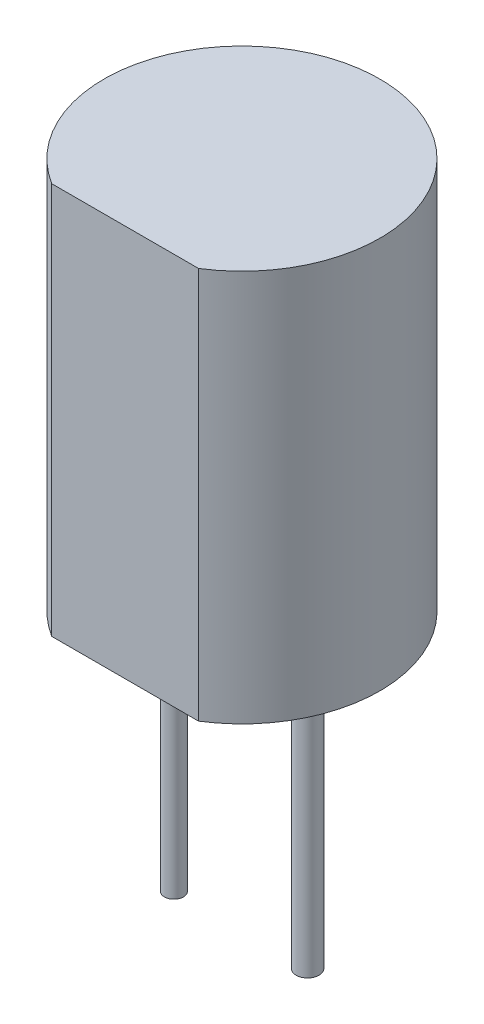
ISO-10303-21;
HEADER;
FILE_DESCRIPTION(('STEP AP214'),'2;1');
FILE_NAME('part.step','',(''),(''),'','','');
FILE_SCHEMA(('AUTOMOTIVE_DESIGN { 1 0 10303 214 1 1 1 1 }'));
ENDSEC;
DATA;
#1=APPLICATION_CONTEXT('core data for automotive mechanical design processes');
#2=APPLICATION_PROTOCOL_DEFINITION('international standard','automotive_design',2000,#1);
#3=PRODUCT_CONTEXT('',#1,'mechanical');
#4=PRODUCT('Part','Part','',(#3));
#5=PRODUCT_RELATED_PRODUCT_CATEGORY('part','',(#4));
#6=PRODUCT_DEFINITION_FORMATION('','',#4);
#7=PRODUCT_DEFINITION_CONTEXT('part definition',#1,'design');
#8=PRODUCT_DEFINITION('design','',#6,#7);
#9=PRODUCT_DEFINITION_SHAPE('','',#8);
#10=(LENGTH_UNIT() NAMED_UNIT(*) SI_UNIT(.MILLI.,.METRE.));
#11=(NAMED_UNIT(*) PLANE_ANGLE_UNIT() SI_UNIT($,.RADIAN.));
#12=(NAMED_UNIT(*) SI_UNIT($,.STERADIAN.) SOLID_ANGLE_UNIT());
#13=UNCERTAINTY_MEASURE_WITH_UNIT(LENGTH_MEASURE(1.E-05),#10,'distance_accuracy_value','');
#14=(GEOMETRIC_REPRESENTATION_CONTEXT(3) GLOBAL_UNCERTAINTY_ASSIGNED_CONTEXT((#13)) GLOBAL_UNIT_ASSIGNED_CONTEXT((#10,
#11,#12)) REPRESENTATION_CONTEXT('',''));
#15=CARTESIAN_POINT('',(0.,0.,0.));
#16=DIRECTION('',(0.,0.,1.));
#17=DIRECTION('',(1.,0.,0.));
#18=AXIS2_PLACEMENT_3D('',#15,#16,#17);
#19=CARTESIAN_POINT('',(0.,5.4,1.60882200359202));
#20=DIRECTION('',(0.,0.,-1.));
#21=DIRECTION('',(-1.,0.,0.));
#22=AXIS2_PLACEMENT_3D('',#19,#20,#21);
#23=PLANE('',#22);
#24=DIRECTION('',(1.,0.,0.));
#25=VECTOR('',#24,1.);
#26=CARTESIAN_POINT('',(0.,0.,1.60882200359202));
#27=LINE('',#26,#25);
#28=CARTESIAN_POINT('',(-1.01078769321661,0.,1.60882200359202));
#29=VERTEX_POINT('',#28);
#30=CARTESIAN_POINT('',(1.01078769321661,0.,1.60882200359202));
#31=VERTEX_POINT('',#30);
#32=EDGE_CURVE('E68',#29,#31,#27,.T.);
#33=ORIENTED_EDGE('',*,*,#32,.T.);
#34=DIRECTION('',(0.,-1.,0.));
#35=VECTOR('',#34,1.);
#36=CARTESIAN_POINT('',(1.01078769321661,5.4,1.60882200359202));
#37=LINE('',#36,#35);
#38=CARTESIAN_POINT('',(1.01078769321661,5.4,1.60882200359202));
#39=VERTEX_POINT('',#38);
#40=EDGE_CURVE('E65',#39,#31,#37,.T.);
#41=ORIENTED_EDGE('',*,*,#40,.F.);
#42=DIRECTION('',(1.,0.,0.));
#43=VECTOR('',#42,1.);
#44=CARTESIAN_POINT('',(0.,5.4,1.60882200359202));
#45=LINE('',#44,#43);
#46=CARTESIAN_POINT('',(-1.01078769321661,5.4,1.60882200359202));
#47=VERTEX_POINT('',#46);
#48=EDGE_CURVE('E67',#47,#39,#45,.T.);
#49=ORIENTED_EDGE('',*,*,#48,.F.);
#50=DIRECTION('',(0.,-1.,0.));
#51=VECTOR('',#50,1.);
#52=CARTESIAN_POINT('',(-1.01078769321661,5.4,1.60882200359202));
#53=LINE('',#52,#51);
#54=EDGE_CURVE('E62',#47,#29,#53,.T.);
#55=ORIENTED_EDGE('',*,*,#54,.T.);
#56=EDGE_LOOP('',(#33,#41,#49,#55));
#57=FACE_BOUND('',#56,.T.);
#58=ADVANCED_FACE('F34',(#57),#23,.F.);
#59=CARTESIAN_POINT('',(0.,5.4,0.));
#60=DIRECTION('',(0.,-1.,0.));
#61=DIRECTION('',(0.,0.,-1.));
#62=AXIS2_PLACEMENT_3D('',#59,#60,#61);
#63=CYLINDRICAL_SURFACE('',#62,1.9);
#64=CARTESIAN_POINT('',(0.,0.,0.));
#65=DIRECTION('',(0.,1.,0.));
#66=DIRECTION('',(0.,0.,1.));
#67=AXIS2_PLACEMENT_3D('',#64,#65,#66);
#68=CIRCLE('',#67,1.9);
#69=EDGE_CURVE('E57',#31,#29,#68,.T.);
#70=ORIENTED_EDGE('',*,*,#69,.T.);
#71=ORIENTED_EDGE('',*,*,#54,.F.);
#72=CARTESIAN_POINT('',(0.,5.4,0.));
#73=DIRECTION('',(0.,1.,0.));
#74=DIRECTION('',(0.,0.,1.));
#75=AXIS2_PLACEMENT_3D('',#72,#73,#74);
#76=CIRCLE('',#75,1.9);
#77=EDGE_CURVE('E49',#39,#47,#76,.T.);
#78=ORIENTED_EDGE('',*,*,#77,.F.);
#79=ORIENTED_EDGE('',*,*,#40,.T.);
#80=EDGE_LOOP('',(#70,#71,#78,#79));
#81=FACE_BOUND('',#80,.T.);
#82=ADVANCED_FACE('F61',(#81),#63,.T.);
#83=CARTESIAN_POINT('',(0.,5.4,0.));
#84=DIRECTION('',(0.,1.,0.));
#85=DIRECTION('',(0.,0.,1.));
#86=AXIS2_PLACEMENT_3D('',#83,#84,#85);
#87=PLANE('',#86);
#88=ORIENTED_EDGE('',*,*,#48,.T.);
#89=ORIENTED_EDGE('',*,*,#77,.T.);
#90=EDGE_LOOP('',(#88,#89));
#91=FACE_BOUND('',#90,.T.);
#92=ADVANCED_FACE('F87',(#91),#87,.T.);
#93=CARTESIAN_POINT('',(0.,0.,0.));
#94=DIRECTION('',(0.,1.,0.));
#95=DIRECTION('',(0.,0.,1.));
#96=AXIS2_PLACEMENT_3D('',#93,#94,#95);
#97=PLANE('',#96);
#98=CARTESIAN_POINT('',(-0.936885819906192,0.,0.));
#99=DIRECTION('',(0.,1.,0.));
#100=DIRECTION('',(0.,0.,1.));
#101=AXIS2_PLACEMENT_3D('',#98,#99,#100);
#102=CIRCLE('',#101,0.13121762907077);
#103=CARTESIAN_POINT('',(-0.936885819906192,0.,0.13121762907077));
#104=VERTEX_POINT('',#103);
#105=EDGE_CURVE('E11',#104,#104,#102,.F.);
#106=ORIENTED_EDGE('',*,*,#105,.F.);
#107=EDGE_LOOP('',(#106));
#108=FACE_BOUND('',#107,.T.);
#109=CARTESIAN_POINT('',(0.90457941232322,0.,0.));
#110=DIRECTION('',(0.,1.,0.));
#111=DIRECTION('',(0.,0.,1.));
#112=AXIS2_PLACEMENT_3D('',#109,#110,#111);
#113=CIRCLE('',#112,0.157835319688733);
#114=CARTESIAN_POINT('',(0.90457941232322,0.,0.157835319688733));
#115=VERTEX_POINT('',#114);
#116=EDGE_CURVE('E42',#115,#115,#113,.F.);
#117=ORIENTED_EDGE('',*,*,#116,.F.);
#118=EDGE_LOOP('',(#117));
#119=FACE_BOUND('',#118,.T.);
#120=ORIENTED_EDGE('',*,*,#32,.F.);
#121=ORIENTED_EDGE('',*,*,#69,.F.);
#122=EDGE_LOOP('',(#120,#121));
#123=FACE_BOUND('',#122,.T.);
#124=ADVANCED_FACE('F72',(#108,#119,#123),#97,.F.);
#125=CARTESIAN_POINT('',(0.90457941232322,-3.81,0.));
#126=DIRECTION('',(0.,1.,0.));
#127=DIRECTION('',(0.,0.,1.));
#128=AXIS2_PLACEMENT_3D('',#125,#126,#127);
#129=CYLINDRICAL_SURFACE('',#128,0.157835319688733);
#130=CARTESIAN_POINT('',(0.90457941232322,-3.81,0.));
#131=DIRECTION('',(0.,-1.,0.));
#132=DIRECTION('',(0.,0.,-1.));
#133=AXIS2_PLACEMENT_3D('',#130,#131,#132);
#134=CIRCLE('',#133,0.157835319688733);
#135=CARTESIAN_POINT('',(0.90457941232322,-3.81,-0.157835319688733));
#136=VERTEX_POINT('',#135);
#137=EDGE_CURVE('E73',#136,#136,#134,.T.);
#138=ORIENTED_EDGE('',*,*,#137,.F.);
#139=EDGE_LOOP('',(#138));
#140=FACE_BOUND('',#139,.T.);
#141=ORIENTED_EDGE('',*,*,#116,.T.);
#142=EDGE_LOOP('',(#141));
#143=FACE_BOUND('',#142,.T.);
#144=ADVANCED_FACE('F84',(#140,#143),#129,.T.);
#145=CARTESIAN_POINT('',(0.90457941232322,-3.81,0.));
#146=DIRECTION('',(0.,-1.,0.));
#147=DIRECTION('',(0.,0.,-1.));
#148=AXIS2_PLACEMENT_3D('',#145,#146,#147);
#149=PLANE('',#148);
#150=ORIENTED_EDGE('',*,*,#137,.T.);
#151=EDGE_LOOP('',(#150));
#152=FACE_BOUND('',#151,.T.);
#153=ADVANCED_FACE('F94',(#152),#149,.T.);
#154=CARTESIAN_POINT('',(-0.936885819906192,-3.81,0.));
#155=DIRECTION('',(0.,1.,0.));
#156=DIRECTION('',(0.,0.,1.));
#157=AXIS2_PLACEMENT_3D('',#154,#155,#156);
#158=CYLINDRICAL_SURFACE('',#157,0.13121762907077);
#159=CARTESIAN_POINT('',(-0.936885819906192,-3.81,0.));
#160=DIRECTION('',(0.,-1.,0.));
#161=DIRECTION('',(0.,0.,-1.));
#162=AXIS2_PLACEMENT_3D('',#159,#160,#161);
#163=CIRCLE('',#162,0.13121762907077);
#164=CARTESIAN_POINT('',(-0.936885819906192,-3.81,-0.13121762907077));
#165=VERTEX_POINT('',#164);
#166=EDGE_CURVE('E76',#165,#165,#163,.T.);
#167=ORIENTED_EDGE('',*,*,#166,.F.);
#168=EDGE_LOOP('',(#167));
#169=FACE_BOUND('',#168,.T.);
#170=ORIENTED_EDGE('',*,*,#105,.T.);
#171=EDGE_LOOP('',(#170));
#172=FACE_BOUND('',#171,.T.);
#173=ADVANCED_FACE('F128',(#169,#172),#158,.T.);
#174=CARTESIAN_POINT('',(-0.936885819906192,-3.81,0.));
#175=DIRECTION('',(0.,-1.,0.));
#176=DIRECTION('',(0.,0.,-1.));
#177=AXIS2_PLACEMENT_3D('',#174,#175,#176);
#178=PLANE('',#177);
#179=ORIENTED_EDGE('',*,*,#166,.T.);
#180=EDGE_LOOP('',(#179));
#181=FACE_BOUND('',#180,.T.);
#182=ADVANCED_FACE('F138',(#181),#178,.T.);
#183=CLOSED_SHELL('',(#58,#82,#92,#124,#144,#153,#173,#182));
#184=MANIFOLD_SOLID_BREP('B2',#183);
#185=ADVANCED_BREP_SHAPE_REPRESENTATION('',(#18,#184),#14);
#186=SHAPE_DEFINITION_REPRESENTATION(#9,#185);
ENDSEC;
END-ISO-10303-21;
